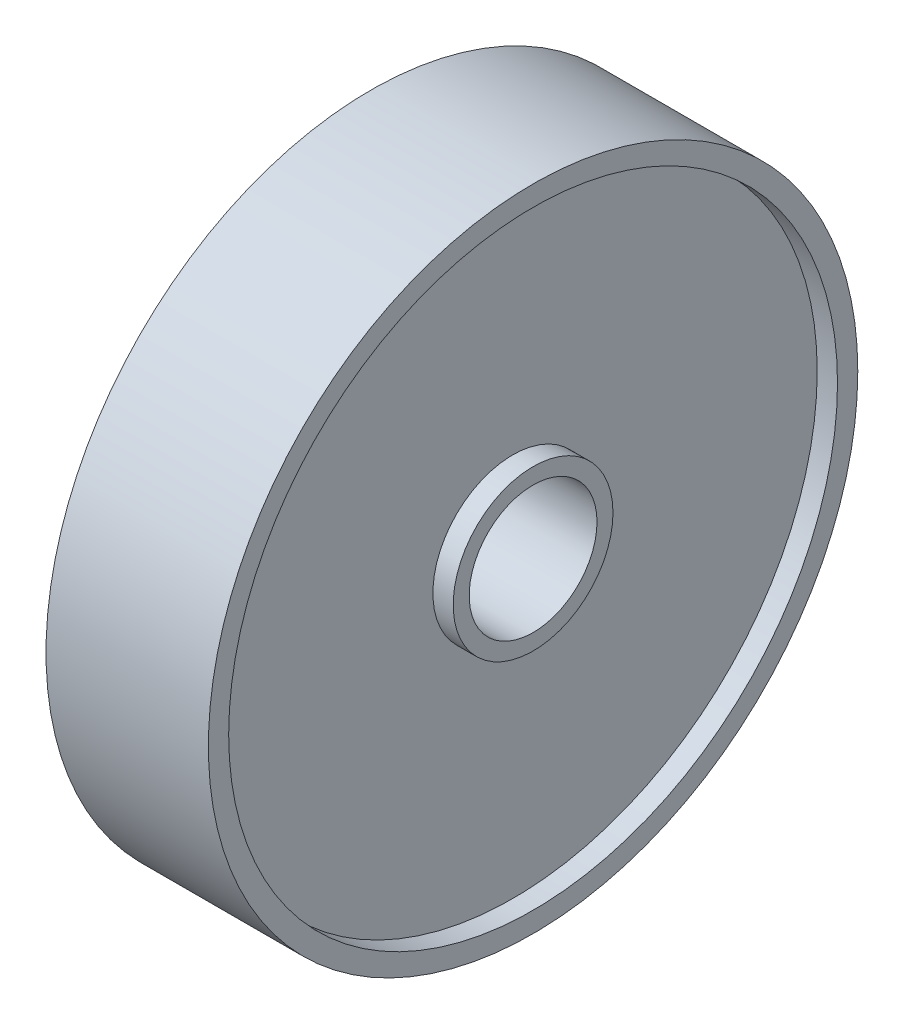
ISO-10303-21;
HEADER;
FILE_DESCRIPTION(('STEP AP214'),'2;1');
FILE_NAME('part.step','',(''),(''),'','','');
FILE_SCHEMA(('AUTOMOTIVE_DESIGN { 1 0 10303 214 1 1 1 1 }'));
ENDSEC;
DATA;
#1=APPLICATION_CONTEXT('core data for automotive mechanical design processes');
#2=APPLICATION_PROTOCOL_DEFINITION('international standard','automotive_design',2000,#1);
#3=PRODUCT_CONTEXT('',#1,'mechanical');
#4=PRODUCT('Part','Part','',(#3));
#5=PRODUCT_RELATED_PRODUCT_CATEGORY('part','',(#4));
#6=PRODUCT_DEFINITION_FORMATION('','',#4);
#7=PRODUCT_DEFINITION_CONTEXT('part definition',#1,'design');
#8=PRODUCT_DEFINITION('design','',#6,#7);
#9=PRODUCT_DEFINITION_SHAPE('','',#8);
#10=(LENGTH_UNIT() NAMED_UNIT(*) SI_UNIT(.MILLI.,.METRE.));
#11=(NAMED_UNIT(*) PLANE_ANGLE_UNIT() SI_UNIT($,.RADIAN.));
#12=(NAMED_UNIT(*) SI_UNIT($,.STERADIAN.) SOLID_ANGLE_UNIT());
#13=UNCERTAINTY_MEASURE_WITH_UNIT(LENGTH_MEASURE(1.E-05),#10,'distance_accuracy_value','');
#14=(GEOMETRIC_REPRESENTATION_CONTEXT(3) GLOBAL_UNCERTAINTY_ASSIGNED_CONTEXT((#13)) GLOBAL_UNIT_ASSIGNED_CONTEXT((#10,
#11,#12)) REPRESENTATION_CONTEXT('',''));
#15=CARTESIAN_POINT('',(0.,0.,0.));
#16=DIRECTION('',(0.,0.,1.));
#17=DIRECTION('',(1.,0.,0.));
#18=AXIS2_PLACEMENT_3D('',#15,#16,#17);
#19=CARTESIAN_POINT('',(50.8,0.,0.));
#20=DIRECTION('',(1.,0.,0.));
#21=DIRECTION('',(0.,0.,-1.));
#22=AXIS2_PLACEMENT_3D('',#19,#20,#21);
#23=PLANE('',#22);
#24=CARTESIAN_POINT('',(50.8,0.,0.));
#25=DIRECTION('',(1.,0.,0.));
#26=DIRECTION('',(0.,0.,-1.));
#27=AXIS2_PLACEMENT_3D('',#24,#25,#26);
#28=CIRCLE('',#27,20.);
#29=CARTESIAN_POINT('',(50.8,0.,-20.));
#30=VERTEX_POINT('',#29);
#31=EDGE_CURVE('E41',#30,#30,#28,.T.);
#32=ORIENTED_EDGE('',*,*,#31,.F.);
#33=EDGE_LOOP('',(#32));
#34=FACE_BOUND('',#33,.T.);
#35=CARTESIAN_POINT('',(50.8,0.,0.));
#36=DIRECTION('',(1.,0.,0.));
#37=DIRECTION('',(0.,0.,-1.));
#38=AXIS2_PLACEMENT_3D('',#35,#36,#37);
#39=CIRCLE('',#38,25.);
#40=CARTESIAN_POINT('',(50.8,0.,-25.));
#41=VERTEX_POINT('',#40);
#42=EDGE_CURVE('E67',#41,#41,#39,.T.);
#43=ORIENTED_EDGE('',*,*,#42,.T.);
#44=EDGE_LOOP('',(#43));
#45=FACE_BOUND('',#44,.T.);
#46=ADVANCED_FACE('F30',(#34,#45),#23,.T.);
#47=CARTESIAN_POINT('',(0.,0.,0.));
#48=DIRECTION('',(1.,0.,0.));
#49=DIRECTION('',(0.,0.,-1.));
#50=AXIS2_PLACEMENT_3D('',#47,#48,#49);
#51=PLANE('',#50);
#52=CARTESIAN_POINT('',(0.,0.,0.));
#53=DIRECTION('',(1.,0.,0.));
#54=DIRECTION('',(0.,0.,-1.));
#55=AXIS2_PLACEMENT_3D('',#52,#53,#54);
#56=CIRCLE('',#55,20.);
#57=CARTESIAN_POINT('',(0.,0.,-20.));
#58=VERTEX_POINT('',#57);
#59=EDGE_CURVE('E43',#58,#58,#56,.T.);
#60=ORIENTED_EDGE('',*,*,#59,.T.);
#61=EDGE_LOOP('',(#60));
#62=FACE_BOUND('',#61,.T.);
#63=CARTESIAN_POINT('',(0.,0.,0.));
#64=DIRECTION('',(-1.,0.,0.));
#65=DIRECTION('',(0.,0.,1.));
#66=AXIS2_PLACEMENT_3D('',#63,#64,#65);
#67=CIRCLE('',#66,25.);
#68=CARTESIAN_POINT('',(0.,0.,25.));
#69=VERTEX_POINT('',#68);
#70=EDGE_CURVE('E55',#69,#69,#67,.T.);
#71=ORIENTED_EDGE('',*,*,#70,.T.);
#72=EDGE_LOOP('',(#71));
#73=FACE_BOUND('',#72,.T.);
#74=ADVANCED_FACE('F92',(#62,#73),#51,.F.);
#75=CARTESIAN_POINT('',(50.8,0.,0.));
#76=DIRECTION('',(1.,0.,0.));
#77=DIRECTION('',(0.,0.,-1.));
#78=AXIS2_PLACEMENT_3D('',#75,#76,#77);
#79=CIRCLE('',#78,95.25);
#80=CARTESIAN_POINT('',(50.8,0.,-95.25));
#81=VERTEX_POINT('',#80);
#82=EDGE_CURVE('E61',#81,#81,#79,.T.);
#83=ORIENTED_EDGE('',*,*,#82,.F.);
#84=EDGE_LOOP('',(#83));
#85=FACE_BOUND('',#84,.T.);
#86=CARTESIAN_POINT('',(50.8,0.,0.));
#87=DIRECTION('',(1.,0.,0.));
#88=DIRECTION('',(0.,0.,-1.));
#89=AXIS2_PLACEMENT_3D('',#86,#87,#88);
#90=CIRCLE('',#89,101.6);
#91=CARTESIAN_POINT('',(50.8,0.,-101.6));
#92=VERTEX_POINT('',#91);
#93=EDGE_CURVE('E10',#92,#92,#90,.T.);
#94=ORIENTED_EDGE('',*,*,#93,.T.);
#95=EDGE_LOOP('',(#94));
#96=FACE_BOUND('',#95,.T.);
#97=ADVANCED_FACE('F89',(#85,#96),#23,.T.);
#98=CARTESIAN_POINT('',(0.,0.,0.));
#99=DIRECTION('',(-1.,0.,0.));
#100=DIRECTION('',(0.,0.,1.));
#101=AXIS2_PLACEMENT_3D('',#98,#99,#100);
#102=CIRCLE('',#101,95.25);
#103=CARTESIAN_POINT('',(0.,0.,95.25));
#104=VERTEX_POINT('',#103);
#105=EDGE_CURVE('E49',#104,#104,#102,.T.);
#106=ORIENTED_EDGE('',*,*,#105,.F.);
#107=EDGE_LOOP('',(#106));
#108=FACE_BOUND('',#107,.T.);
#109=CARTESIAN_POINT('',(0.,0.,0.));
#110=DIRECTION('',(1.,0.,0.));
#111=DIRECTION('',(0.,0.,-1.));
#112=AXIS2_PLACEMENT_3D('',#109,#110,#111);
#113=CIRCLE('',#112,101.6);
#114=CARTESIAN_POINT('',(0.,0.,-101.6));
#115=VERTEX_POINT('',#114);
#116=EDGE_CURVE('E34',#115,#115,#113,.T.);
#117=ORIENTED_EDGE('',*,*,#116,.F.);
#118=EDGE_LOOP('',(#117));
#119=FACE_BOUND('',#118,.T.);
#120=ADVANCED_FACE('F91',(#108,#119),#51,.F.);
#121=CARTESIAN_POINT('',(50.8,0.,0.));
#122=DIRECTION('',(-1.,0.,0.));
#123=DIRECTION('',(0.,0.,1.));
#124=AXIS2_PLACEMENT_3D('',#121,#122,#123);
#125=CYLINDRICAL_SURFACE('',#124,101.6);
#126=ORIENTED_EDGE('',*,*,#93,.F.);
#127=EDGE_LOOP('',(#126));
#128=FACE_BOUND('',#127,.T.);
#129=ORIENTED_EDGE('',*,*,#116,.T.);
#130=EDGE_LOOP('',(#129));
#131=FACE_BOUND('',#130,.T.);
#132=ADVANCED_FACE('F32',(#128,#131),#125,.T.);
#133=CARTESIAN_POINT('',(50.8,0.,0.));
#134=DIRECTION('',(-1.,0.,0.));
#135=DIRECTION('',(0.,0.,1.));
#136=AXIS2_PLACEMENT_3D('',#133,#134,#135);
#137=CYLINDRICAL_SURFACE('',#136,20.);
#138=ORIENTED_EDGE('',*,*,#31,.T.);
#139=EDGE_LOOP('',(#138));
#140=FACE_BOUND('',#139,.T.);
#141=ORIENTED_EDGE('',*,*,#59,.F.);
#142=EDGE_LOOP('',(#141));
#143=FACE_BOUND('',#142,.T.);
#144=ADVANCED_FACE('F122',(#140,#143),#137,.F.);
#145=CARTESIAN_POINT('',(6.35,0.,0.));
#146=DIRECTION('',(-1.,0.,0.));
#147=DIRECTION('',(0.,0.,1.));
#148=AXIS2_PLACEMENT_3D('',#145,#146,#147);
#149=CYLINDRICAL_SURFACE('',#148,95.25);
#150=CARTESIAN_POINT('',(6.35,0.,0.));
#151=DIRECTION('',(-1.,0.,0.));
#152=DIRECTION('',(0.,0.,1.));
#153=AXIS2_PLACEMENT_3D('',#150,#151,#152);
#154=CIRCLE('',#153,95.25);
#155=CARTESIAN_POINT('',(6.35,0.,95.25));
#156=VERTEX_POINT('',#155);
#157=EDGE_CURVE('E46',#156,#156,#154,.T.);
#158=ORIENTED_EDGE('',*,*,#157,.F.);
#159=EDGE_LOOP('',(#158));
#160=FACE_BOUND('',#159,.T.);
#161=ORIENTED_EDGE('',*,*,#105,.T.);
#162=EDGE_LOOP('',(#161));
#163=FACE_BOUND('',#162,.T.);
#164=ADVANCED_FACE('F119',(#160,#163),#149,.F.);
#165=CARTESIAN_POINT('',(6.35,0.,0.));
#166=DIRECTION('',(-1.,0.,0.));
#167=DIRECTION('',(0.,0.,1.));
#168=AXIS2_PLACEMENT_3D('',#165,#166,#167);
#169=PLANE('',#168);
#170=CARTESIAN_POINT('',(6.35,0.,0.));
#171=DIRECTION('',(-1.,0.,0.));
#172=DIRECTION('',(0.,0.,1.));
#173=AXIS2_PLACEMENT_3D('',#170,#171,#172);
#174=CIRCLE('',#173,25.);
#175=CARTESIAN_POINT('',(6.35,0.,25.));
#176=VERTEX_POINT('',#175);
#177=EDGE_CURVE('E52',#176,#176,#174,.T.);
#178=ORIENTED_EDGE('',*,*,#177,.F.);
#179=EDGE_LOOP('',(#178));
#180=FACE_BOUND('',#179,.T.);
#181=ORIENTED_EDGE('',*,*,#157,.T.);
#182=EDGE_LOOP('',(#181));
#183=FACE_BOUND('',#182,.T.);
#184=ADVANCED_FACE('F115',(#180,#183),#169,.T.);
#185=CARTESIAN_POINT('',(6.35,0.,0.));
#186=DIRECTION('',(-1.,0.,0.));
#187=DIRECTION('',(0.,0.,1.));
#188=AXIS2_PLACEMENT_3D('',#185,#186,#187);
#189=CYLINDRICAL_SURFACE('',#188,25.);
#190=ORIENTED_EDGE('',*,*,#177,.T.);
#191=EDGE_LOOP('',(#190));
#192=FACE_BOUND('',#191,.T.);
#193=ORIENTED_EDGE('',*,*,#70,.F.);
#194=EDGE_LOOP('',(#193));
#195=FACE_BOUND('',#194,.T.);
#196=ADVANCED_FACE('F85',(#192,#195),#189,.T.);
#197=CARTESIAN_POINT('',(44.45,0.,0.));
#198=DIRECTION('',(1.,0.,0.));
#199=DIRECTION('',(0.,0.,-1.));
#200=AXIS2_PLACEMENT_3D('',#197,#198,#199);
#201=CYLINDRICAL_SURFACE('',#200,95.25);
#202=CARTESIAN_POINT('',(44.45,0.,0.));
#203=DIRECTION('',(1.,0.,0.));
#204=DIRECTION('',(0.,0.,-1.));
#205=AXIS2_PLACEMENT_3D('',#202,#203,#204);
#206=CIRCLE('',#205,95.25);
#207=CARTESIAN_POINT('',(44.45,0.,-95.25));
#208=VERTEX_POINT('',#207);
#209=EDGE_CURVE('E58',#208,#208,#206,.T.);
#210=ORIENTED_EDGE('',*,*,#209,.F.);
#211=EDGE_LOOP('',(#210));
#212=FACE_BOUND('',#211,.T.);
#213=ORIENTED_EDGE('',*,*,#82,.T.);
#214=EDGE_LOOP('',(#213));
#215=FACE_BOUND('',#214,.T.);
#216=ADVANCED_FACE('F79',(#212,#215),#201,.F.);
#217=CARTESIAN_POINT('',(44.45,0.,0.));
#218=DIRECTION('',(1.,0.,0.));
#219=DIRECTION('',(0.,0.,-1.));
#220=AXIS2_PLACEMENT_3D('',#217,#218,#219);
#221=PLANE('',#220);
#222=CARTESIAN_POINT('',(44.45,0.,0.));
#223=DIRECTION('',(1.,0.,0.));
#224=DIRECTION('',(0.,0.,-1.));
#225=AXIS2_PLACEMENT_3D('',#222,#223,#224);
#226=CIRCLE('',#225,25.);
#227=CARTESIAN_POINT('',(44.45,0.,-25.));
#228=VERTEX_POINT('',#227);
#229=EDGE_CURVE('E64',#228,#228,#226,.T.);
#230=ORIENTED_EDGE('',*,*,#229,.F.);
#231=EDGE_LOOP('',(#230));
#232=FACE_BOUND('',#231,.T.);
#233=ORIENTED_EDGE('',*,*,#209,.T.);
#234=EDGE_LOOP('',(#233));
#235=FACE_BOUND('',#234,.T.);
#236=ADVANCED_FACE('F76',(#232,#235),#221,.T.);
#237=CARTESIAN_POINT('',(44.45,0.,0.));
#238=DIRECTION('',(1.,0.,0.));
#239=DIRECTION('',(0.,0.,-1.));
#240=AXIS2_PLACEMENT_3D('',#237,#238,#239);
#241=CYLINDRICAL_SURFACE('',#240,25.);
#242=ORIENTED_EDGE('',*,*,#229,.T.);
#243=EDGE_LOOP('',(#242));
#244=FACE_BOUND('',#243,.T.);
#245=ORIENTED_EDGE('',*,*,#42,.F.);
#246=EDGE_LOOP('',(#245));
#247=FACE_BOUND('',#246,.T.);
#248=ADVANCED_FACE('F73',(#244,#247),#241,.T.);
#249=CLOSED_SHELL('',(#46,#74,#97,#120,#132,#144,#164,#184,#196,#216,#236,#248));
#250=MANIFOLD_SOLID_BREP('B2',#249);
#251=ADVANCED_BREP_SHAPE_REPRESENTATION('',(#18,#250),#14);
#252=SHAPE_DEFINITION_REPRESENTATION(#9,#251);
ENDSEC;
END-ISO-10303-21;
